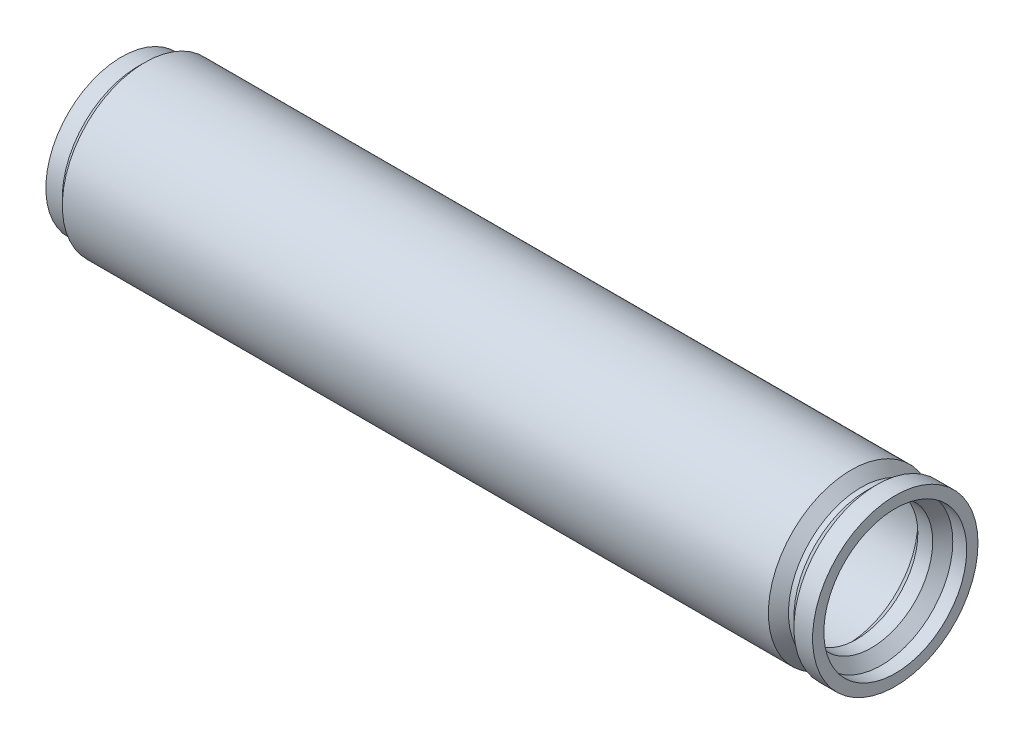
ISO-10303-21;
HEADER;
FILE_DESCRIPTION(('STEP AP214'),'2;1');
FILE_NAME('part.step','',(''),(''),'','','');
FILE_SCHEMA(('AUTOMOTIVE_DESIGN { 1 0 10303 214 1 1 1 1 }'));
ENDSEC;
DATA;
#1=APPLICATION_CONTEXT('core data for automotive mechanical design processes');
#2=APPLICATION_PROTOCOL_DEFINITION('international standard','automotive_design',2000,#1);
#3=PRODUCT_CONTEXT('',#1,'mechanical');
#4=PRODUCT('Part','Part','',(#3));
#5=PRODUCT_RELATED_PRODUCT_CATEGORY('part','',(#4));
#6=PRODUCT_DEFINITION_FORMATION('','',#4);
#7=PRODUCT_DEFINITION_CONTEXT('part definition',#1,'design');
#8=PRODUCT_DEFINITION('design','',#6,#7);
#9=PRODUCT_DEFINITION_SHAPE('','',#8);
#10=(LENGTH_UNIT() NAMED_UNIT(*) SI_UNIT(.MILLI.,.METRE.));
#11=(NAMED_UNIT(*) PLANE_ANGLE_UNIT() SI_UNIT($,.RADIAN.));
#12=(NAMED_UNIT(*) SI_UNIT($,.STERADIAN.) SOLID_ANGLE_UNIT());
#13=UNCERTAINTY_MEASURE_WITH_UNIT(LENGTH_MEASURE(1.E-05),#10,'distance_accuracy_value','');
#14=(GEOMETRIC_REPRESENTATION_CONTEXT(3) GLOBAL_UNCERTAINTY_ASSIGNED_CONTEXT((#13)) GLOBAL_UNIT_ASSIGNED_CONTEXT((#10,
#11,#12)) REPRESENTATION_CONTEXT('',''));
#15=CARTESIAN_POINT('',(0.,0.,0.));
#16=DIRECTION('',(0.,0.,1.));
#17=DIRECTION('',(1.,0.,0.));
#18=AXIS2_PLACEMENT_3D('',#15,#16,#17);
#19=CARTESIAN_POINT('',(0.,13.8074,0.));
#20=DIRECTION('',(-1.,0.,0.));
#21=DIRECTION('',(0.,0.,1.));
#22=AXIS2_PLACEMENT_3D('',#19,#20,#21);
#23=PLANE('',#22);
#24=CARTESIAN_POINT('',(0.,0.,0.));
#25=DIRECTION('',(1.,0.,0.));
#26=DIRECTION('',(0.,0.,-1.));
#27=AXIS2_PLACEMENT_3D('',#24,#25,#26);
#28=CIRCLE('',#27,11.75);
#29=CARTESIAN_POINT('',(0.,0.,-11.75));
#30=VERTEX_POINT('',#29);
#31=EDGE_CURVE('E69',#30,#30,#28,.T.);
#32=ORIENTED_EDGE('',*,*,#31,.T.);
#33=EDGE_LOOP('',(#32));
#34=FACE_BOUND('',#33,.T.);
#35=CARTESIAN_POINT('',(0.,0.,0.));
#36=DIRECTION('',(1.,0.,0.));
#37=DIRECTION('',(0.,0.,-1.));
#38=AXIS2_PLACEMENT_3D('',#35,#36,#37);
#39=CIRCLE('',#38,13.8074);
#40=CARTESIAN_POINT('',(0.,0.,-13.8074));
#41=VERTEX_POINT('',#40);
#42=EDGE_CURVE('E65',#41,#41,#39,.T.);
#43=ORIENTED_EDGE('',*,*,#42,.F.);
#44=EDGE_LOOP('',(#43));
#45=FACE_BOUND('',#44,.T.);
#46=ADVANCED_FACE('F15',(#34,#45),#23,.T.);
#47=CARTESIAN_POINT('',(141.,0.,0.));
#48=DIRECTION('',(1.,0.,0.));
#49=DIRECTION('',(0.,0.,-1.));
#50=AXIS2_PLACEMENT_3D('',#47,#48,#49);
#51=CYLINDRICAL_SURFACE('',#50,11.75);
#52=CARTESIAN_POINT('',(3.85220297999999,0.,0.));
#53=DIRECTION('',(1.,0.,0.));
#54=DIRECTION('',(0.,0.,-1.));
#55=AXIS2_PLACEMENT_3D('',#52,#53,#54);
#56=CIRCLE('',#55,11.75);
#57=CARTESIAN_POINT('',(3.85220297999999,0.,-11.75));
#58=VERTEX_POINT('',#57);
#59=EDGE_CURVE('E62',#58,#58,#56,.T.);
#60=ORIENTED_EDGE('',*,*,#59,.T.);
#61=EDGE_LOOP('',(#60));
#62=FACE_BOUND('',#61,.T.);
#63=ORIENTED_EDGE('',*,*,#31,.F.);
#64=EDGE_LOOP('',(#63));
#65=FACE_BOUND('',#64,.T.);
#66=ADVANCED_FACE('F72',(#62,#65),#51,.F.);
#67=CARTESIAN_POINT('',(3.85220298,0.,0.));
#68=DIRECTION('',(1.,0.,0.));
#69=DIRECTION('',(0.,0.,-1.));
#70=AXIS2_PLACEMENT_3D('',#67,#68,#69);
#71=CONICAL_SURFACE('',#70,11.75,0.785398163397446);
#72=CARTESIAN_POINT('',(5.11970298,0.,0.));
#73=DIRECTION('',(1.,0.,0.));
#74=DIRECTION('',(0.,0.,-1.));
#75=AXIS2_PLACEMENT_3D('',#72,#73,#74);
#76=CIRCLE('',#75,13.0175);
#77=CARTESIAN_POINT('',(5.11970298,0.,-13.0175));
#78=VERTEX_POINT('',#77);
#79=EDGE_CURVE('E56',#78,#78,#76,.T.);
#80=ORIENTED_EDGE('',*,*,#79,.T.);
#81=EDGE_LOOP('',(#80));
#82=FACE_BOUND('',#81,.T.);
#83=ORIENTED_EDGE('',*,*,#59,.F.);
#84=EDGE_LOOP('',(#83));
#85=FACE_BOUND('',#84,.T.);
#86=ADVANCED_FACE('F76',(#82,#85),#71,.F.);
#87=CARTESIAN_POINT('',(141.,0.,0.));
#88=DIRECTION('',(1.,0.,0.));
#89=DIRECTION('',(0.,0.,-1.));
#90=AXIS2_PLACEMENT_3D('',#87,#88,#89);
#91=CYLINDRICAL_SURFACE('',#90,13.0175);
#92=CARTESIAN_POINT('',(132.09559403,0.,0.));
#93=DIRECTION('',(1.,0.,0.));
#94=DIRECTION('',(0.,0.,-1.));
#95=AXIS2_PLACEMENT_3D('',#92,#93,#94);
#96=CIRCLE('',#95,13.0175);
#97=CARTESIAN_POINT('',(132.09559403,0.,-13.0175));
#98=VERTEX_POINT('',#97);
#99=EDGE_CURVE('E57',#98,#98,#96,.T.);
#100=ORIENTED_EDGE('',*,*,#99,.T.);
#101=EDGE_LOOP('',(#100));
#102=FACE_BOUND('',#101,.T.);
#103=ORIENTED_EDGE('',*,*,#79,.F.);
#104=EDGE_LOOP('',(#103));
#105=FACE_BOUND('',#104,.T.);
#106=ADVANCED_FACE('F81',(#102,#105),#91,.F.);
#107=CARTESIAN_POINT('',(132.09559403,0.,0.));
#108=DIRECTION('',(-1.,0.,0.));
#109=DIRECTION('',(0.,0.,1.));
#110=AXIS2_PLACEMENT_3D('',#107,#108,#109);
#111=CONICAL_SURFACE('',#110,13.0175,0.785398163397449);
#112=CARTESIAN_POINT('',(133.92559403,0.,0.));
#113=DIRECTION('',(1.,0.,0.));
#114=DIRECTION('',(0.,0.,-1.));
#115=AXIS2_PLACEMENT_3D('',#112,#113,#114);
#116=CIRCLE('',#115,11.1875);
#117=CARTESIAN_POINT('',(133.92559403,0.,-11.1875));
#118=VERTEX_POINT('',#117);
#119=EDGE_CURVE('E52',#118,#118,#116,.T.);
#120=ORIENTED_EDGE('',*,*,#119,.T.);
#121=EDGE_LOOP('',(#120));
#122=FACE_BOUND('',#121,.T.);
#123=ORIENTED_EDGE('',*,*,#99,.F.);
#124=EDGE_LOOP('',(#123));
#125=FACE_BOUND('',#124,.T.);
#126=ADVANCED_FACE('F93',(#122,#125),#111,.F.);
#127=CARTESIAN_POINT('',(141.,0.,0.));
#128=DIRECTION('',(1.,0.,0.));
#129=DIRECTION('',(0.,0.,-1.));
#130=AXIS2_PLACEMENT_3D('',#127,#128,#129);
#131=CYLINDRICAL_SURFACE('',#130,11.1875);
#132=CARTESIAN_POINT('',(136.63,0.,0.));
#133=DIRECTION('',(1.,0.,0.));
#134=DIRECTION('',(0.,0.,-1.));
#135=AXIS2_PLACEMENT_3D('',#132,#133,#134);
#136=CIRCLE('',#135,11.1875);
#137=CARTESIAN_POINT('',(136.63,0.,-11.1875));
#138=VERTEX_POINT('',#137);
#139=EDGE_CURVE('E49',#138,#138,#136,.T.);
#140=ORIENTED_EDGE('',*,*,#139,.T.);
#141=EDGE_LOOP('',(#140));
#142=FACE_BOUND('',#141,.T.);
#143=ORIENTED_EDGE('',*,*,#119,.F.);
#144=EDGE_LOOP('',(#143));
#145=FACE_BOUND('',#144,.T.);
#146=ADVANCED_FACE('F92',(#142,#145),#131,.F.);
#147=CARTESIAN_POINT('',(136.63,0.,0.));
#148=DIRECTION('',(1.,0.,0.));
#149=DIRECTION('',(0.,0.,-1.));
#150=AXIS2_PLACEMENT_3D('',#147,#148,#149);
#151=CONICAL_SURFACE('',#150,11.1875,0.785398163397449);
#152=CARTESIAN_POINT('',(138.46,0.,0.));
#153=DIRECTION('',(1.,0.,0.));
#154=DIRECTION('',(0.,0.,-1.));
#155=AXIS2_PLACEMENT_3D('',#152,#153,#154);
#156=CIRCLE('',#155,13.0175);
#157=CARTESIAN_POINT('',(138.46,0.,-13.0175));
#158=VERTEX_POINT('',#157);
#159=EDGE_CURVE('E50',#158,#158,#156,.T.);
#160=ORIENTED_EDGE('',*,*,#159,.T.);
#161=EDGE_LOOP('',(#160));
#162=FACE_BOUND('',#161,.T.);
#163=ORIENTED_EDGE('',*,*,#139,.F.);
#164=EDGE_LOOP('',(#163));
#165=FACE_BOUND('',#164,.T.);
#166=ADVANCED_FACE('F97',(#162,#165),#151,.F.);
#167=CARTESIAN_POINT('',(141.,0.,0.));
#168=DIRECTION('',(1.,0.,0.));
#169=DIRECTION('',(0.,0.,-1.));
#170=AXIS2_PLACEMENT_3D('',#167,#168,#169);
#171=CYLINDRICAL_SURFACE('',#170,13.0175);
#172=CARTESIAN_POINT('',(141.,0.,0.));
#173=DIRECTION('',(1.,0.,0.));
#174=DIRECTION('',(0.,0.,-1.));
#175=AXIS2_PLACEMENT_3D('',#172,#173,#174);
#176=CIRCLE('',#175,13.0175);
#177=CARTESIAN_POINT('',(141.,0.,-13.0175));
#178=VERTEX_POINT('',#177);
#179=EDGE_CURVE('E42',#178,#178,#176,.T.);
#180=ORIENTED_EDGE('',*,*,#179,.T.);
#181=EDGE_LOOP('',(#180));
#182=FACE_BOUND('',#181,.T.);
#183=ORIENTED_EDGE('',*,*,#159,.F.);
#184=EDGE_LOOP('',(#183));
#185=FACE_BOUND('',#184,.T.);
#186=ADVANCED_FACE('F103',(#182,#185),#171,.F.);
#187=CARTESIAN_POINT('',(141.,13.0175,0.));
#188=DIRECTION('',(1.,0.,0.));
#189=DIRECTION('',(0.,0.,-1.));
#190=AXIS2_PLACEMENT_3D('',#187,#188,#189);
#191=PLANE('',#190);
#192=CARTESIAN_POINT('',(141.,0.,0.));
#193=DIRECTION('',(1.,0.,0.));
#194=DIRECTION('',(0.,0.,-1.));
#195=AXIS2_PLACEMENT_3D('',#192,#193,#194);
#196=CIRCLE('',#195,15.0749);
#197=CARTESIAN_POINT('',(141.,0.,-15.0749));
#198=VERTEX_POINT('',#197);
#199=EDGE_CURVE('E41',#198,#198,#196,.T.);
#200=ORIENTED_EDGE('',*,*,#199,.T.);
#201=EDGE_LOOP('',(#200));
#202=FACE_BOUND('',#201,.T.);
#203=ORIENTED_EDGE('',*,*,#179,.F.);
#204=EDGE_LOOP('',(#203));
#205=FACE_BOUND('',#204,.T.);
#206=ADVANCED_FACE('F110',(#202,#205),#191,.T.);
#207=CARTESIAN_POINT('',(141.,0.,0.));
#208=DIRECTION('',(1.,0.,0.));
#209=DIRECTION('',(0.,0.,-1.));
#210=AXIS2_PLACEMENT_3D('',#207,#208,#209);
#211=CYLINDRICAL_SURFACE('',#210,15.0749);
#212=CARTESIAN_POINT('',(137.60779702,0.,0.));
#213=DIRECTION('',(1.,0.,0.));
#214=DIRECTION('',(0.,0.,-1.));
#215=AXIS2_PLACEMENT_3D('',#212,#213,#214);
#216=CIRCLE('',#215,15.0749);
#217=CARTESIAN_POINT('',(137.60779702,0.,-15.0749));
#218=VERTEX_POINT('',#217);
#219=EDGE_CURVE('E36',#218,#218,#216,.T.);
#220=ORIENTED_EDGE('',*,*,#219,.T.);
#221=EDGE_LOOP('',(#220));
#222=FACE_BOUND('',#221,.T.);
#223=ORIENTED_EDGE('',*,*,#199,.F.);
#224=EDGE_LOOP('',(#223));
#225=FACE_BOUND('',#224,.T.);
#226=ADVANCED_FACE('F112',(#222,#225),#211,.T.);
#227=CARTESIAN_POINT('',(137.60779702,0.,0.));
#228=DIRECTION('',(1.,0.,0.));
#229=DIRECTION('',(0.,0.,-1.));
#230=AXIS2_PLACEMENT_3D('',#227,#228,#229);
#231=CONICAL_SURFACE('',#230,15.0749,0.785398163397449);
#232=CARTESIAN_POINT('',(135.77779702,0.,0.));
#233=DIRECTION('',(1.,0.,0.));
#234=DIRECTION('',(0.,0.,-1.));
#235=AXIS2_PLACEMENT_3D('',#232,#233,#234);
#236=CIRCLE('',#235,13.2449);
#237=CARTESIAN_POINT('',(135.77779702,0.,-13.2449));
#238=VERTEX_POINT('',#237);
#239=EDGE_CURVE('E34',#238,#238,#236,.T.);
#240=ORIENTED_EDGE('',*,*,#239,.T.);
#241=EDGE_LOOP('',(#240));
#242=FACE_BOUND('',#241,.T.);
#243=ORIENTED_EDGE('',*,*,#219,.F.);
#244=EDGE_LOOP('',(#243));
#245=FACE_BOUND('',#244,.T.);
#246=ADVANCED_FACE('F113',(#242,#245),#231,.T.);
#247=CARTESIAN_POINT('',(141.,0.,0.));
#248=DIRECTION('',(1.,0.,0.));
#249=DIRECTION('',(0.,0.,-1.));
#250=AXIS2_PLACEMENT_3D('',#247,#248,#249);
#251=CYLINDRICAL_SURFACE('',#250,13.2449);
#252=CARTESIAN_POINT('',(134.77779702,0.,0.));
#253=DIRECTION('',(1.,0.,0.));
#254=DIRECTION('',(0.,0.,-1.));
#255=AXIS2_PLACEMENT_3D('',#252,#253,#254);
#256=CIRCLE('',#255,13.2449);
#257=CARTESIAN_POINT('',(134.77779702,0.,-13.2449));
#258=VERTEX_POINT('',#257);
#259=EDGE_CURVE('E28',#258,#258,#256,.T.);
#260=ORIENTED_EDGE('',*,*,#259,.T.);
#261=EDGE_LOOP('',(#260));
#262=FACE_BOUND('',#261,.T.);
#263=ORIENTED_EDGE('',*,*,#239,.F.);
#264=EDGE_LOOP('',(#263));
#265=FACE_BOUND('',#264,.T.);
#266=ADVANCED_FACE('F118',(#262,#265),#251,.T.);
#267=CARTESIAN_POINT('',(134.77779702,0.,0.));
#268=DIRECTION('',(-1.,0.,0.));
#269=DIRECTION('',(0.,0.,1.));
#270=AXIS2_PLACEMENT_3D('',#267,#268,#269);
#271=CONICAL_SURFACE('',#270,13.2449,0.785398163397449);
#272=CARTESIAN_POINT('',(132.94779702,0.,0.));
#273=DIRECTION('',(1.,0.,0.));
#274=DIRECTION('',(0.,0.,-1.));
#275=AXIS2_PLACEMENT_3D('',#272,#273,#274);
#276=CIRCLE('',#275,15.0749);
#277=CARTESIAN_POINT('',(132.94779702,0.,-15.0749));
#278=VERTEX_POINT('',#277);
#279=EDGE_CURVE('E27',#278,#278,#276,.T.);
#280=ORIENTED_EDGE('',*,*,#279,.T.);
#281=EDGE_LOOP('',(#280));
#282=FACE_BOUND('',#281,.T.);
#283=ORIENTED_EDGE('',*,*,#259,.F.);
#284=EDGE_LOOP('',(#283));
#285=FACE_BOUND('',#284,.T.);
#286=ADVANCED_FACE('F124',(#282,#285),#271,.T.);
#287=CARTESIAN_POINT('',(141.,0.,0.));
#288=DIRECTION('',(1.,0.,0.));
#289=DIRECTION('',(0.,0.,-1.));
#290=AXIS2_PLACEMENT_3D('',#287,#288,#289);
#291=CYLINDRICAL_SURFACE('',#290,15.0749);
#292=CARTESIAN_POINT('',(4.26750000000001,0.,0.));
#293=DIRECTION('',(1.,0.,0.));
#294=DIRECTION('',(0.,0.,-1.));
#295=AXIS2_PLACEMENT_3D('',#292,#293,#294);
#296=CIRCLE('',#295,15.0749);
#297=CARTESIAN_POINT('',(4.26750000000001,0.,-15.0749));
#298=VERTEX_POINT('',#297);
#299=EDGE_CURVE('E22',#298,#298,#296,.T.);
#300=ORIENTED_EDGE('',*,*,#299,.T.);
#301=EDGE_LOOP('',(#300));
#302=FACE_BOUND('',#301,.T.);
#303=ORIENTED_EDGE('',*,*,#279,.F.);
#304=EDGE_LOOP('',(#303));
#305=FACE_BOUND('',#304,.T.);
#306=ADVANCED_FACE('F126',(#302,#305),#291,.T.);
#307=CARTESIAN_POINT('',(4.2675,0.,0.));
#308=DIRECTION('',(1.,0.,0.));
#309=DIRECTION('',(0.,0.,-1.));
#310=AXIS2_PLACEMENT_3D('',#307,#308,#309);
#311=CONICAL_SURFACE('',#310,15.0749,0.785398163397446);
#312=CARTESIAN_POINT('',(3.,0.,0.));
#313=DIRECTION('',(1.,0.,0.));
#314=DIRECTION('',(0.,0.,-1.));
#315=AXIS2_PLACEMENT_3D('',#312,#313,#314);
#316=CIRCLE('',#315,13.8074);
#317=CARTESIAN_POINT('',(3.,0.,-13.8074));
#318=VERTEX_POINT('',#317);
#319=EDGE_CURVE('E10',#318,#318,#316,.T.);
#320=ORIENTED_EDGE('',*,*,#319,.T.);
#321=EDGE_LOOP('',(#320));
#322=FACE_BOUND('',#321,.T.);
#323=ORIENTED_EDGE('',*,*,#299,.F.);
#324=EDGE_LOOP('',(#323));
#325=FACE_BOUND('',#324,.T.);
#326=ADVANCED_FACE('F129',(#322,#325),#311,.T.);
#327=CARTESIAN_POINT('',(141.,0.,0.));
#328=DIRECTION('',(1.,0.,0.));
#329=DIRECTION('',(0.,0.,-1.));
#330=AXIS2_PLACEMENT_3D('',#327,#328,#329);
#331=CYLINDRICAL_SURFACE('',#330,13.8074);
#332=ORIENTED_EDGE('',*,*,#42,.T.);
#333=EDGE_LOOP('',(#332));
#334=FACE_BOUND('',#333,.T.);
#335=ORIENTED_EDGE('',*,*,#319,.F.);
#336=EDGE_LOOP('',(#335));
#337=FACE_BOUND('',#336,.T.);
#338=ADVANCED_FACE('F17',(#334,#337),#331,.T.);
#339=CLOSED_SHELL('',(#46,#66,#86,#106,#126,#146,#166,#186,#206,#226,#246,#266,#286,#306,#326,#338));
#340=MANIFOLD_SOLID_BREP('B1',#339);
#341=ADVANCED_BREP_SHAPE_REPRESENTATION('',(#18,#340),#14);
#342=SHAPE_DEFINITION_REPRESENTATION(#9,#341);
ENDSEC;
END-ISO-10303-21;
